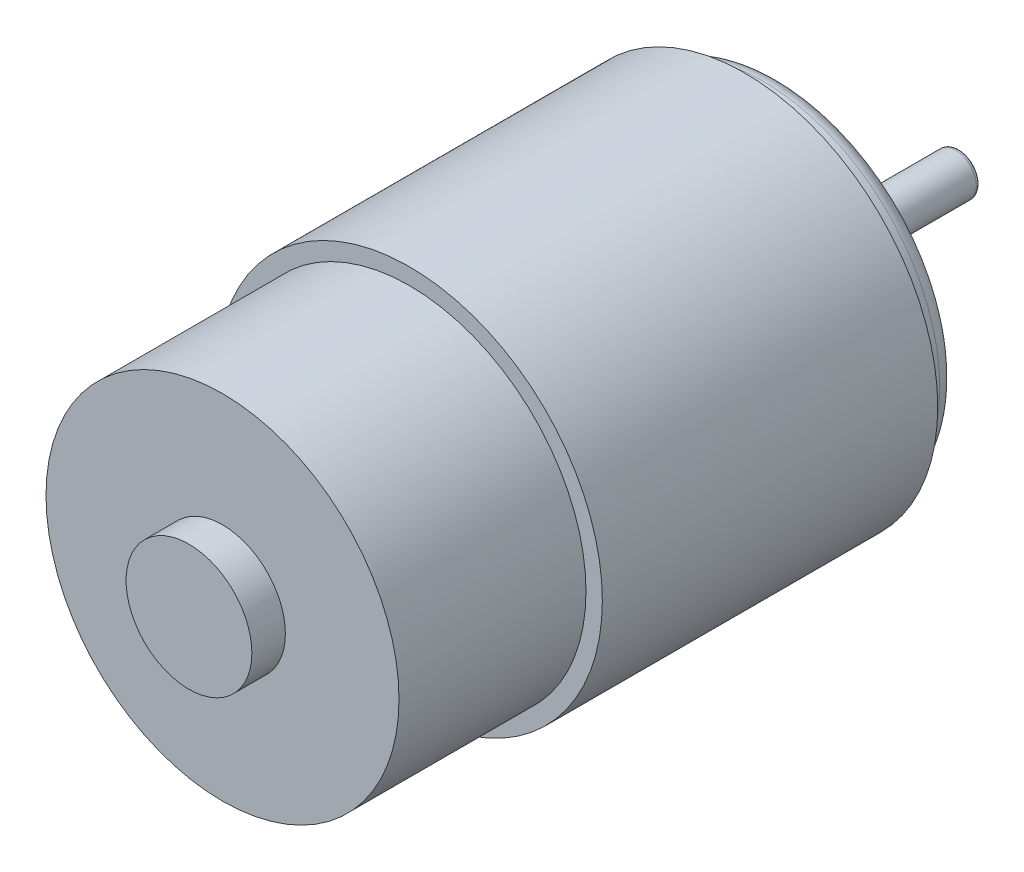
ISO-10303-21;
HEADER;
FILE_DESCRIPTION(('STEP AP214'),'2;1');
FILE_NAME('part.step','',(''),(''),'','','');
FILE_SCHEMA(('AUTOMOTIVE_DESIGN { 1 0 10303 214 1 1 1 1 }'));
ENDSEC;
DATA;
#1=APPLICATION_CONTEXT('core data for automotive mechanical design processes');
#2=APPLICATION_PROTOCOL_DEFINITION('international standard','automotive_design',2000,#1);
#3=PRODUCT_CONTEXT('',#1,'mechanical');
#4=PRODUCT('Part','Part','',(#3));
#5=PRODUCT_RELATED_PRODUCT_CATEGORY('part','',(#4));
#6=PRODUCT_DEFINITION_FORMATION('','',#4);
#7=PRODUCT_DEFINITION_CONTEXT('part definition',#1,'design');
#8=PRODUCT_DEFINITION('design','',#6,#7);
#9=PRODUCT_DEFINITION_SHAPE('','',#8);
#10=(LENGTH_UNIT() NAMED_UNIT(*) SI_UNIT(.MILLI.,.METRE.));
#11=(NAMED_UNIT(*) PLANE_ANGLE_UNIT() SI_UNIT($,.RADIAN.));
#12=(NAMED_UNIT(*) SI_UNIT($,.STERADIAN.) SOLID_ANGLE_UNIT());
#13=UNCERTAINTY_MEASURE_WITH_UNIT(LENGTH_MEASURE(1.E-05),#10,'distance_accuracy_value','');
#14=(GEOMETRIC_REPRESENTATION_CONTEXT(3) GLOBAL_UNCERTAINTY_ASSIGNED_CONTEXT((#13)) GLOBAL_UNIT_ASSIGNED_CONTEXT((#10,
#11,#12)) REPRESENTATION_CONTEXT('',''));
#15=CARTESIAN_POINT('',(0.,0.,0.));
#16=DIRECTION('',(0.,0.,1.));
#17=DIRECTION('',(1.,0.,0.));
#18=AXIS2_PLACEMENT_3D('',#15,#16,#17);
#19=CARTESIAN_POINT('',(0.,0.,40.));
#20=DIRECTION('',(0.,0.,-1.));
#21=DIRECTION('',(-1.,0.,0.));
#22=AXIS2_PLACEMENT_3D('',#19,#20,#21);
#23=CYLINDRICAL_SURFACE('',#22,23.);
#24=CARTESIAN_POINT('',(0.,0.,40.));
#25=DIRECTION('',(0.,0.,1.));
#26=DIRECTION('',(1.,0.,0.));
#27=AXIS2_PLACEMENT_3D('',#24,#25,#26);
#28=CIRCLE('',#27,23.);
#29=CARTESIAN_POINT('',(23.,0.,40.));
#30=VERTEX_POINT('',#29);
#31=EDGE_CURVE('E75',#30,#30,#28,.T.);
#32=ORIENTED_EDGE('',*,*,#31,.F.);
#33=EDGE_LOOP('',(#32));
#34=FACE_BOUND('',#33,.T.);
#35=CARTESIAN_POINT('',(0.,0.,0.));
#36=DIRECTION('',(0.,0.,1.));
#37=DIRECTION('',(1.,0.,0.));
#38=AXIS2_PLACEMENT_3D('',#35,#36,#37);
#39=CIRCLE('',#38,23.);
#40=CARTESIAN_POINT('',(23.,0.,0.));
#41=VERTEX_POINT('',#40);
#42=EDGE_CURVE('E72',#41,#41,#39,.T.);
#43=ORIENTED_EDGE('',*,*,#42,.T.);
#44=EDGE_LOOP('',(#43));
#45=FACE_BOUND('',#44,.T.);
#46=ADVANCED_FACE('F41',(#34,#45),#23,.T.);
#47=CARTESIAN_POINT('',(0.,0.,40.));
#48=DIRECTION('',(0.,0.,1.));
#49=DIRECTION('',(1.,0.,0.));
#50=AXIS2_PLACEMENT_3D('',#47,#48,#49);
#51=PLANE('',#50);
#52=CARTESIAN_POINT('',(0.,0.,40.));
#53=DIRECTION('',(0.,0.,1.));
#54=DIRECTION('',(1.,0.,0.));
#55=AXIS2_PLACEMENT_3D('',#52,#53,#54);
#56=CIRCLE('',#55,21.05);
#57=CARTESIAN_POINT('',(21.05,0.,40.));
#58=VERTEX_POINT('',#57);
#59=EDGE_CURVE('E69',#58,#58,#56,.T.);
#60=ORIENTED_EDGE('',*,*,#59,.F.);
#61=EDGE_LOOP('',(#60));
#62=FACE_BOUND('',#61,.T.);
#63=ORIENTED_EDGE('',*,*,#31,.T.);
#64=EDGE_LOOP('',(#63));
#65=FACE_BOUND('',#64,.T.);
#66=ADVANCED_FACE('F111',(#62,#65),#51,.T.);
#67=CARTESIAN_POINT('',(0.,0.,0.));
#68=DIRECTION('',(0.,0.,1.));
#69=DIRECTION('',(1.,0.,0.));
#70=AXIS2_PLACEMENT_3D('',#67,#68,#69);
#71=PLANE('',#70);
#72=CARTESIAN_POINT('',(0.,0.,0.));
#73=DIRECTION('',(0.,0.,-1.));
#74=DIRECTION('',(-1.,0.,0.));
#75=AXIS2_PLACEMENT_3D('',#72,#73,#74);
#76=CIRCLE('',#75,21.05);
#77=CARTESIAN_POINT('',(-21.05,0.,0.));
#78=VERTEX_POINT('',#77);
#79=EDGE_CURVE('E65',#78,#78,#76,.T.);
#80=ORIENTED_EDGE('',*,*,#79,.F.);
#81=EDGE_LOOP('',(#80));
#82=FACE_BOUND('',#81,.T.);
#83=ORIENTED_EDGE('',*,*,#42,.F.);
#84=EDGE_LOOP('',(#83));
#85=FACE_BOUND('',#84,.T.);
#86=ADVANCED_FACE('F117',(#82,#85),#71,.F.);
#87=CARTESIAN_POINT('',(0.,0.,62.3));
#88=DIRECTION('',(0.,0.,-1.));
#89=DIRECTION('',(-1.,0.,0.));
#90=AXIS2_PLACEMENT_3D('',#87,#88,#89);
#91=CYLINDRICAL_SURFACE('',#90,21.05);
#92=CARTESIAN_POINT('',(0.,0.,62.3));
#93=DIRECTION('',(0.,0.,1.));
#94=DIRECTION('',(1.,0.,0.));
#95=AXIS2_PLACEMENT_3D('',#92,#93,#94);
#96=CIRCLE('',#95,21.05);
#97=CARTESIAN_POINT('',(21.05,0.,62.3));
#98=VERTEX_POINT('',#97);
#99=EDGE_CURVE('E64',#98,#98,#96,.T.);
#100=ORIENTED_EDGE('',*,*,#99,.F.);
#101=EDGE_LOOP('',(#100));
#102=FACE_BOUND('',#101,.T.);
#103=ORIENTED_EDGE('',*,*,#59,.T.);
#104=EDGE_LOOP('',(#103));
#105=FACE_BOUND('',#104,.T.);
#106=ADVANCED_FACE('F170',(#102,#105),#91,.T.);
#107=CARTESIAN_POINT('',(0.,0.,62.3));
#108=DIRECTION('',(0.,0.,1.));
#109=DIRECTION('',(1.,0.,0.));
#110=AXIS2_PLACEMENT_3D('',#107,#108,#109);
#111=PLANE('',#110);
#112=CARTESIAN_POINT('',(0.,0.,62.3));
#113=DIRECTION('',(0.,0.,1.));
#114=DIRECTION('',(1.,0.,0.));
#115=AXIS2_PLACEMENT_3D('',#112,#113,#114);
#116=CIRCLE('',#115,7.5);
#117=CARTESIAN_POINT('',(7.5,0.,62.3));
#118=VERTEX_POINT('',#117);
#119=EDGE_CURVE('E10',#118,#118,#116,.T.);
#120=ORIENTED_EDGE('',*,*,#119,.F.);
#121=EDGE_LOOP('',(#120));
#122=FACE_BOUND('',#121,.T.);
#123=ORIENTED_EDGE('',*,*,#99,.T.);
#124=EDGE_LOOP('',(#123));
#125=FACE_BOUND('',#124,.T.);
#126=ADVANCED_FACE('F163',(#122,#125),#111,.T.);
#127=CARTESIAN_POINT('',(0.,0.,-4.2));
#128=DIRECTION('',(0.,0.,1.));
#129=DIRECTION('',(1.,0.,0.));
#130=AXIS2_PLACEMENT_3D('',#127,#128,#129);
#131=CYLINDRICAL_SURFACE('',#130,21.05);
#132=CARTESIAN_POINT('',(0.,0.,-2.2));
#133=DIRECTION('',(0.,0.,-1.));
#134=DIRECTION('',(-1.,0.,0.));
#135=AXIS2_PLACEMENT_3D('',#132,#133,#134);
#136=CIRCLE('',#135,21.05);
#137=CARTESIAN_POINT('',(-21.05,0.,-2.2));
#138=VERTEX_POINT('',#137);
#139=EDGE_CURVE('E82',#138,#138,#136,.F.);
#140=ORIENTED_EDGE('',*,*,#139,.T.);
#141=EDGE_LOOP('',(#140));
#142=FACE_BOUND('',#141,.T.);
#143=ORIENTED_EDGE('',*,*,#79,.T.);
#144=EDGE_LOOP('',(#143));
#145=FACE_BOUND('',#144,.T.);
#146=ADVANCED_FACE('F153',(#142,#145),#131,.T.);
#147=CARTESIAN_POINT('',(0.,0.,-4.2));
#148=DIRECTION('',(0.,0.,-1.));
#149=DIRECTION('',(-1.,0.,0.));
#150=AXIS2_PLACEMENT_3D('',#147,#148,#149);
#151=PLANE('',#150);
#152=CARTESIAN_POINT('',(0.,14.5,-4.2));
#153=DIRECTION('',(0.,0.,-1.));
#154=DIRECTION('',(-1.,0.,0.));
#155=AXIS2_PLACEMENT_3D('',#152,#153,#154);
#156=CIRCLE('',#155,2.25);
#157=CARTESIAN_POINT('',(-2.25,14.5,-4.2));
#158=VERTEX_POINT('',#157);
#159=EDGE_CURVE('E326',#158,#158,#156,.T.);
#160=ORIENTED_EDGE('',*,*,#159,.F.);
#161=EDGE_LOOP('',(#160));
#162=FACE_BOUND('',#161,.T.);
#163=CARTESIAN_POINT('',(-14.5,0.,-4.2));
#164=DIRECTION('',(0.,0.,-1.));
#165=DIRECTION('',(-1.,0.,0.));
#166=AXIS2_PLACEMENT_3D('',#163,#164,#165);
#167=CIRCLE('',#166,2.25);
#168=CARTESIAN_POINT('',(-16.75,0.,-4.2));
#169=VERTEX_POINT('',#168);
#170=EDGE_CURVE('E330',#169,#169,#167,.T.);
#171=ORIENTED_EDGE('',*,*,#170,.F.);
#172=EDGE_LOOP('',(#171));
#173=FACE_BOUND('',#172,.T.);
#174=CARTESIAN_POINT('',(0.,-14.5,-4.2));
#175=DIRECTION('',(0.,0.,-1.));
#176=DIRECTION('',(-1.,0.,0.));
#177=AXIS2_PLACEMENT_3D('',#174,#175,#176);
#178=CIRCLE('',#177,2.25);
#179=CARTESIAN_POINT('',(-2.25,-14.5,-4.2));
#180=VERTEX_POINT('',#179);
#181=EDGE_CURVE('E338',#180,#180,#178,.T.);
#182=ORIENTED_EDGE('',*,*,#181,.F.);
#183=EDGE_LOOP('',(#182));
#184=FACE_BOUND('',#183,.T.);
#185=CARTESIAN_POINT('',(14.5,0.,-4.2));
#186=DIRECTION('',(0.,0.,-1.));
#187=DIRECTION('',(-1.,0.,0.));
#188=AXIS2_PLACEMENT_3D('',#185,#186,#187);
#189=CIRCLE('',#188,2.25);
#190=CARTESIAN_POINT('',(12.25,0.,-4.2));
#191=VERTEX_POINT('',#190);
#192=EDGE_CURVE('E344',#191,#191,#189,.T.);
#193=ORIENTED_EDGE('',*,*,#192,.F.);
#194=EDGE_LOOP('',(#193));
#195=FACE_BOUND('',#194,.T.);
#196=CARTESIAN_POINT('',(0.,0.,-4.2));
#197=DIRECTION('',(0.,0.,-1.));
#198=DIRECTION('',(-1.,0.,0.));
#199=AXIS2_PLACEMENT_3D('',#196,#197,#198);
#200=CIRCLE('',#199,7.5);
#201=CARTESIAN_POINT('',(-7.5,0.,-4.2));
#202=VERTEX_POINT('',#201);
#203=EDGE_CURVE('E61',#202,#202,#200,.T.);
#204=ORIENTED_EDGE('',*,*,#203,.F.);
#205=EDGE_LOOP('',(#204));
#206=FACE_BOUND('',#205,.T.);
#207=CARTESIAN_POINT('',(0.,0.,-4.2));
#208=DIRECTION('',(0.,0.,-1.));
#209=DIRECTION('',(-1.,0.,0.));
#210=AXIS2_PLACEMENT_3D('',#207,#208,#209);
#211=CIRCLE('',#210,19.05);
#212=CARTESIAN_POINT('',(-19.05,0.,-4.2));
#213=VERTEX_POINT('',#212);
#214=EDGE_CURVE('E68',#213,#213,#211,.T.);
#215=ORIENTED_EDGE('',*,*,#214,.T.);
#216=EDGE_LOOP('',(#215));
#217=FACE_BOUND('',#216,.T.);
#218=ADVANCED_FACE('F127',(#162,#173,#184,#195,#206,#217),#151,.T.);
#219=CARTESIAN_POINT('',(0.,0.,-2.2));
#220=DIRECTION('',(0.,0.,-1.));
#221=DIRECTION('',(-1.,0.,0.));
#222=AXIS2_PLACEMENT_3D('',#219,#220,#221);
#223=TOROIDAL_SURFACE('',#222,19.05,2.);
#224=ORIENTED_EDGE('',*,*,#139,.F.);
#225=EDGE_LOOP('',(#224));
#226=FACE_BOUND('',#225,.T.);
#227=ORIENTED_EDGE('',*,*,#214,.F.);
#228=EDGE_LOOP('',(#227));
#229=FACE_BOUND('',#228,.T.);
#230=ADVANCED_FACE('F124',(#226,#229),#223,.T.);
#231=CARTESIAN_POINT('',(0.,0.,-8.6));
#232=DIRECTION('',(0.,0.,1.));
#233=DIRECTION('',(1.,0.,0.));
#234=AXIS2_PLACEMENT_3D('',#231,#232,#233);
#235=CYLINDRICAL_SURFACE('',#234,7.5);
#236=CARTESIAN_POINT('',(0.,0.,-6.6));
#237=DIRECTION('',(0.,0.,-1.));
#238=DIRECTION('',(-1.,0.,0.));
#239=AXIS2_PLACEMENT_3D('',#236,#237,#238);
#240=CIRCLE('',#239,7.5);
#241=CARTESIAN_POINT('',(-7.5,0.,-6.6));
#242=VERTEX_POINT('',#241);
#243=EDGE_CURVE('E88',#242,#242,#240,.F.);
#244=ORIENTED_EDGE('',*,*,#243,.T.);
#245=EDGE_LOOP('',(#244));
#246=FACE_BOUND('',#245,.T.);
#247=ORIENTED_EDGE('',*,*,#203,.T.);
#248=EDGE_LOOP('',(#247));
#249=FACE_BOUND('',#248,.T.);
#250=ADVANCED_FACE('F126',(#246,#249),#235,.T.);
#251=CARTESIAN_POINT('',(0.,0.,-8.6));
#252=DIRECTION('',(0.,0.,-1.));
#253=DIRECTION('',(-1.,0.,0.));
#254=AXIS2_PLACEMENT_3D('',#251,#252,#253);
#255=PLANE('',#254);
#256=CARTESIAN_POINT('',(0.,0.,-8.6));
#257=DIRECTION('',(0.,0.,-1.));
#258=DIRECTION('',(-1.,0.,0.));
#259=AXIS2_PLACEMENT_3D('',#256,#257,#258);
#260=CIRCLE('',#259,2.5);
#261=CARTESIAN_POINT('',(-2.5,0.,-8.6));
#262=VERTEX_POINT('',#261);
#263=EDGE_CURVE('E58',#262,#262,#260,.T.);
#264=ORIENTED_EDGE('',*,*,#263,.F.);
#265=EDGE_LOOP('',(#264));
#266=FACE_BOUND('',#265,.T.);
#267=CARTESIAN_POINT('',(0.,0.,-8.6));
#268=DIRECTION('',(0.,0.,-1.));
#269=DIRECTION('',(-1.,0.,0.));
#270=AXIS2_PLACEMENT_3D('',#267,#268,#269);
#271=CIRCLE('',#270,5.5);
#272=CARTESIAN_POINT('',(-5.5,0.,-8.6));
#273=VERTEX_POINT('',#272);
#274=EDGE_CURVE('E85',#273,#273,#271,.T.);
#275=ORIENTED_EDGE('',*,*,#274,.T.);
#276=EDGE_LOOP('',(#275));
#277=FACE_BOUND('',#276,.T.);
#278=ADVANCED_FACE('F131',(#266,#277),#255,.T.);
#279=CARTESIAN_POINT('',(0.,0.,-6.6));
#280=DIRECTION('',(0.,0.,-1.));
#281=DIRECTION('',(-1.,0.,0.));
#282=AXIS2_PLACEMENT_3D('',#279,#280,#281);
#283=TOROIDAL_SURFACE('',#282,5.5,2.);
#284=ORIENTED_EDGE('',*,*,#243,.F.);
#285=EDGE_LOOP('',(#284));
#286=FACE_BOUND('',#285,.T.);
#287=ORIENTED_EDGE('',*,*,#274,.F.);
#288=EDGE_LOOP('',(#287));
#289=FACE_BOUND('',#288,.T.);
#290=ADVANCED_FACE('F129',(#286,#289),#283,.T.);
#291=CARTESIAN_POINT('',(0.,0.,-25.6));
#292=DIRECTION('',(0.,0.,1.));
#293=DIRECTION('',(1.,0.,0.));
#294=AXIS2_PLACEMENT_3D('',#291,#292,#293);
#295=CYLINDRICAL_SURFACE('',#294,2.5);
#296=CARTESIAN_POINT('',(0.,0.,-25.1));
#297=DIRECTION('',(0.,0.,-1.));
#298=DIRECTION('',(-1.,0.,0.));
#299=AXIS2_PLACEMENT_3D('',#296,#297,#298);
#300=CIRCLE('',#299,2.5);
#301=CARTESIAN_POINT('',(-2.5,0.,-25.1));
#302=VERTEX_POINT('',#301);
#303=EDGE_CURVE('E45',#302,#302,#300,.F.);
#304=ORIENTED_EDGE('',*,*,#303,.T.);
#305=EDGE_LOOP('',(#304));
#306=FACE_BOUND('',#305,.T.);
#307=ORIENTED_EDGE('',*,*,#263,.T.);
#308=EDGE_LOOP('',(#307));
#309=FACE_BOUND('',#308,.T.);
#310=ADVANCED_FACE('F107',(#306,#309),#295,.T.);
#311=CARTESIAN_POINT('',(0.,0.,-25.6));
#312=DIRECTION('',(0.,0.,-1.));
#313=DIRECTION('',(-1.,0.,0.));
#314=AXIS2_PLACEMENT_3D('',#311,#312,#313);
#315=PLANE('',#314);
#316=CARTESIAN_POINT('',(0.,0.,-25.6));
#317=DIRECTION('',(0.,0.,-1.));
#318=DIRECTION('',(-1.,0.,0.));
#319=AXIS2_PLACEMENT_3D('',#316,#317,#318);
#320=CIRCLE('',#319,2.);
#321=CARTESIAN_POINT('',(-2.,0.,-25.6));
#322=VERTEX_POINT('',#321);
#323=EDGE_CURVE('E53',#322,#322,#320,.T.);
#324=ORIENTED_EDGE('',*,*,#323,.T.);
#325=EDGE_LOOP('',(#324));
#326=FACE_BOUND('',#325,.T.);
#327=ADVANCED_FACE('F93',(#326),#315,.T.);
#328=CARTESIAN_POINT('',(0.,0.,-25.1));
#329=DIRECTION('',(0.,0.,-1.));
#330=DIRECTION('',(-1.,0.,0.));
#331=AXIS2_PLACEMENT_3D('',#328,#329,#330);
#332=TOROIDAL_SURFACE('',#331,2.,0.5);
#333=ORIENTED_EDGE('',*,*,#303,.F.);
#334=EDGE_LOOP('',(#333));
#335=FACE_BOUND('',#334,.T.);
#336=ORIENTED_EDGE('',*,*,#323,.F.);
#337=EDGE_LOOP('',(#336));
#338=FACE_BOUND('',#337,.T.);
#339=ADVANCED_FACE('F43',(#335,#338),#332,.T.);
#340=CARTESIAN_POINT('',(0.,0.,66.3));
#341=DIRECTION('',(0.,0.,-1.));
#342=DIRECTION('',(-1.,0.,0.));
#343=AXIS2_PLACEMENT_3D('',#340,#341,#342);
#344=CYLINDRICAL_SURFACE('',#343,7.5);
#345=CARTESIAN_POINT('',(0.,0.,66.3));
#346=DIRECTION('',(0.,0.,1.));
#347=DIRECTION('',(1.,0.,0.));
#348=AXIS2_PLACEMENT_3D('',#345,#346,#347);
#349=CIRCLE('',#348,7.5);
#350=CARTESIAN_POINT('',(7.5,0.,66.3));
#351=VERTEX_POINT('',#350);
#352=EDGE_CURVE('E56',#351,#351,#349,.T.);
#353=ORIENTED_EDGE('',*,*,#352,.F.);
#354=EDGE_LOOP('',(#353));
#355=FACE_BOUND('',#354,.T.);
#356=ORIENTED_EDGE('',*,*,#119,.T.);
#357=EDGE_LOOP('',(#356));
#358=FACE_BOUND('',#357,.T.);
#359=ADVANCED_FACE('F96',(#355,#358),#344,.T.);
#360=CARTESIAN_POINT('',(0.,0.,66.3));
#361=DIRECTION('',(0.,0.,1.));
#362=DIRECTION('',(1.,0.,0.));
#363=AXIS2_PLACEMENT_3D('',#360,#361,#362);
#364=PLANE('',#363);
#365=ORIENTED_EDGE('',*,*,#352,.T.);
#366=EDGE_LOOP('',(#365));
#367=FACE_BOUND('',#366,.T.);
#368=ADVANCED_FACE('F103',(#367),#364,.T.);
#369=CARTESIAN_POINT('',(14.5,0.,-3.5));
#370=DIRECTION('',(0.,0.,-1.));
#371=DIRECTION('',(-1.,0.,0.));
#372=AXIS2_PLACEMENT_3D('',#369,#370,#371);
#373=CYLINDRICAL_SURFACE('',#372,2.25);
#374=CARTESIAN_POINT('',(14.5,0.,-3.5));
#375=DIRECTION('',(0.,0.,-1.));
#376=DIRECTION('',(-1.,0.,0.));
#377=AXIS2_PLACEMENT_3D('',#374,#375,#376);
#378=CIRCLE('',#377,2.25);
#379=CARTESIAN_POINT('',(12.25,0.,-3.5));
#380=VERTEX_POINT('',#379);
#381=EDGE_CURVE('E346',#380,#380,#378,.T.);
#382=ORIENTED_EDGE('',*,*,#381,.F.);
#383=EDGE_LOOP('',(#382));
#384=FACE_BOUND('',#383,.T.);
#385=ORIENTED_EDGE('',*,*,#192,.T.);
#386=EDGE_LOOP('',(#385));
#387=FACE_BOUND('',#386,.T.);
#388=ADVANCED_FACE('F241',(#384,#387),#373,.F.);
#389=CARTESIAN_POINT('',(14.5,0.,-3.5));
#390=DIRECTION('',(0.,0.,-1.));
#391=DIRECTION('',(-1.,0.,0.));
#392=AXIS2_PLACEMENT_3D('',#389,#390,#391);
#393=PLANE('',#392);
#394=ORIENTED_EDGE('',*,*,#381,.T.);
#395=EDGE_LOOP('',(#394));
#396=FACE_BOUND('',#395,.T.);
#397=ADVANCED_FACE('F249',(#396),#393,.T.);
#398=CARTESIAN_POINT('',(0.,-14.5,-3.5));
#399=DIRECTION('',(0.,0.,-1.));
#400=DIRECTION('',(-1.,0.,0.));
#401=AXIS2_PLACEMENT_3D('',#398,#399,#400);
#402=CYLINDRICAL_SURFACE('',#401,2.25);
#403=CARTESIAN_POINT('',(0.,-14.5,-3.5));
#404=DIRECTION('',(0.,0.,-1.));
#405=DIRECTION('',(-1.,0.,0.));
#406=AXIS2_PLACEMENT_3D('',#403,#404,#405);
#407=CIRCLE('',#406,2.25);
#408=CARTESIAN_POINT('',(-2.25,-14.5,-3.5));
#409=VERTEX_POINT('',#408);
#410=EDGE_CURVE('E341',#409,#409,#407,.T.);
#411=ORIENTED_EDGE('',*,*,#410,.F.);
#412=EDGE_LOOP('',(#411));
#413=FACE_BOUND('',#412,.T.);
#414=ORIENTED_EDGE('',*,*,#181,.T.);
#415=EDGE_LOOP('',(#414));
#416=FACE_BOUND('',#415,.T.);
#417=ADVANCED_FACE('F258',(#413,#416),#402,.F.);
#418=CARTESIAN_POINT('',(0.,-14.5,-3.5));
#419=DIRECTION('',(0.,0.,-1.));
#420=DIRECTION('',(-1.,0.,0.));
#421=AXIS2_PLACEMENT_3D('',#418,#419,#420);
#422=PLANE('',#421);
#423=ORIENTED_EDGE('',*,*,#410,.T.);
#424=EDGE_LOOP('',(#423));
#425=FACE_BOUND('',#424,.T.);
#426=ADVANCED_FACE('F267',(#425),#422,.T.);
#427=CARTESIAN_POINT('',(-14.5,0.,-3.5));
#428=DIRECTION('',(0.,0.,-1.));
#429=DIRECTION('',(-1.,0.,0.));
#430=AXIS2_PLACEMENT_3D('',#427,#428,#429);
#431=CYLINDRICAL_SURFACE('',#430,2.25);
#432=CARTESIAN_POINT('',(-14.5,0.,-3.5));
#433=DIRECTION('',(0.,0.,-1.));
#434=DIRECTION('',(-1.,0.,0.));
#435=AXIS2_PLACEMENT_3D('',#432,#433,#434);
#436=CIRCLE('',#435,2.25);
#437=CARTESIAN_POINT('',(-16.75,0.,-3.5));
#438=VERTEX_POINT('',#437);
#439=EDGE_CURVE('E335',#438,#438,#436,.T.);
#440=ORIENTED_EDGE('',*,*,#439,.F.);
#441=EDGE_LOOP('',(#440));
#442=FACE_BOUND('',#441,.T.);
#443=ORIENTED_EDGE('',*,*,#170,.T.);
#444=EDGE_LOOP('',(#443));
#445=FACE_BOUND('',#444,.T.);
#446=ADVANCED_FACE('F276',(#442,#445),#431,.F.);
#447=CARTESIAN_POINT('',(-14.5,0.,-3.5));
#448=DIRECTION('',(0.,0.,-1.));
#449=DIRECTION('',(-1.,0.,0.));
#450=AXIS2_PLACEMENT_3D('',#447,#448,#449);
#451=PLANE('',#450);
#452=ORIENTED_EDGE('',*,*,#439,.T.);
#453=EDGE_LOOP('',(#452));
#454=FACE_BOUND('',#453,.T.);
#455=ADVANCED_FACE('F285',(#454),#451,.T.);
#456=CARTESIAN_POINT('',(0.,14.5,-3.5));
#457=DIRECTION('',(0.,0.,-1.));
#458=DIRECTION('',(-1.,0.,0.));
#459=AXIS2_PLACEMENT_3D('',#456,#457,#458);
#460=CYLINDRICAL_SURFACE('',#459,2.25);
#461=CARTESIAN_POINT('',(0.,14.5,-3.5));
#462=DIRECTION('',(0.,0.,-1.));
#463=DIRECTION('',(-1.,0.,0.));
#464=AXIS2_PLACEMENT_3D('',#461,#462,#463);
#465=CIRCLE('',#464,2.25);
#466=CARTESIAN_POINT('',(-2.25,14.5,-3.5));
#467=VERTEX_POINT('',#466);
#468=EDGE_CURVE('E325',#467,#467,#465,.T.);
#469=ORIENTED_EDGE('',*,*,#468,.F.);
#470=EDGE_LOOP('',(#469));
#471=FACE_BOUND('',#470,.T.);
#472=ORIENTED_EDGE('',*,*,#159,.T.);
#473=EDGE_LOOP('',(#472));
#474=FACE_BOUND('',#473,.T.);
#475=ADVANCED_FACE('F294',(#471,#474),#460,.F.);
#476=CARTESIAN_POINT('',(0.,14.5,-3.5));
#477=DIRECTION('',(0.,0.,-1.));
#478=DIRECTION('',(-1.,0.,0.));
#479=AXIS2_PLACEMENT_3D('',#476,#477,#478);
#480=PLANE('',#479);
#481=ORIENTED_EDGE('',*,*,#468,.T.);
#482=EDGE_LOOP('',(#481));
#483=FACE_BOUND('',#482,.T.);
#484=ADVANCED_FACE('F303',(#483),#480,.T.);
#485=CLOSED_SHELL('',(#46,#66,#86,#106,#126,#146,#218,#230,#250,#278,#290,#310,#327,#339,#359,
#368,#388,#397,#417,#426,#446,#455,#475,#484));
#486=MANIFOLD_SOLID_BREP('B2',#485);
#487=ADVANCED_BREP_SHAPE_REPRESENTATION('',(#18,#486),#14);
#488=SHAPE_DEFINITION_REPRESENTATION(#9,#487);
ENDSEC;
END-ISO-10303-21;
